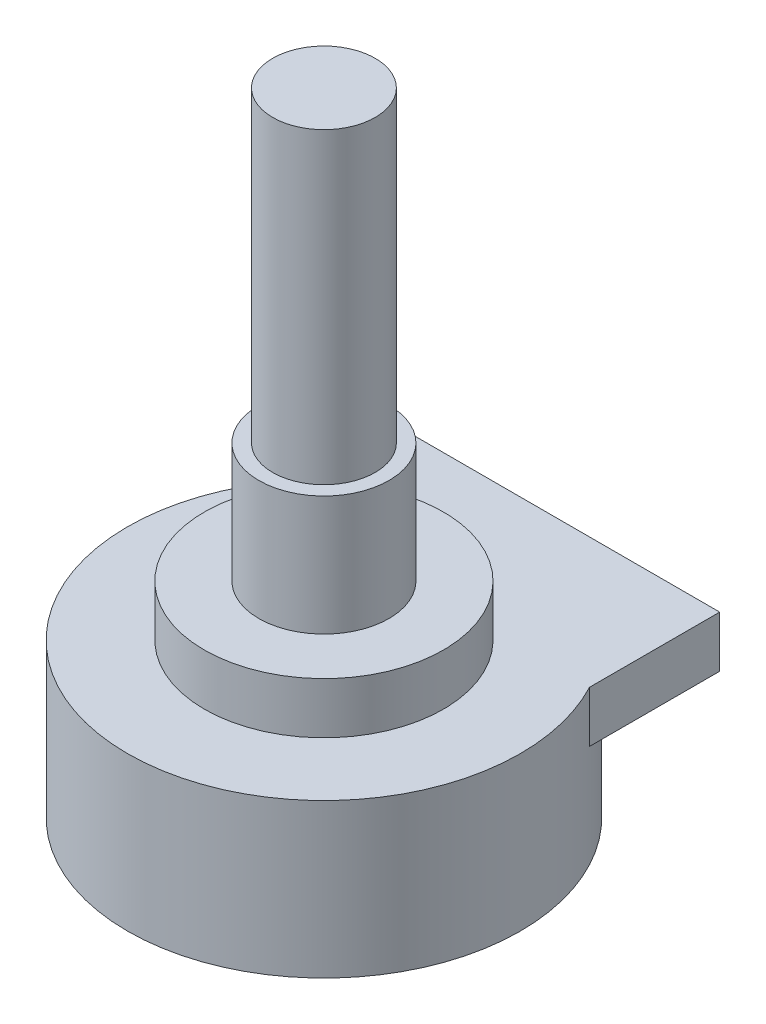
ISO-10303-21;
HEADER;
FILE_DESCRIPTION(('STEP AP214'),'2;1');
FILE_NAME('part.step','',(''),(''),'','','');
FILE_SCHEMA(('AUTOMOTIVE_DESIGN { 1 0 10303 214 1 1 1 1 }'));
ENDSEC;
DATA;
#1=APPLICATION_CONTEXT('core data for automotive mechanical design processes');
#2=APPLICATION_PROTOCOL_DEFINITION('international standard','automotive_design',2000,#1);
#3=PRODUCT_CONTEXT('',#1,'mechanical');
#4=PRODUCT('Part','Part','',(#3));
#5=PRODUCT_RELATED_PRODUCT_CATEGORY('part','',(#4));
#6=PRODUCT_DEFINITION_FORMATION('','',#4);
#7=PRODUCT_DEFINITION_CONTEXT('part definition',#1,'design');
#8=PRODUCT_DEFINITION('design','',#6,#7);
#9=PRODUCT_DEFINITION_SHAPE('','',#8);
#10=(LENGTH_UNIT() NAMED_UNIT(*) SI_UNIT(.MILLI.,.METRE.));
#11=(NAMED_UNIT(*) PLANE_ANGLE_UNIT() SI_UNIT($,.RADIAN.));
#12=(NAMED_UNIT(*) SI_UNIT($,.STERADIAN.) SOLID_ANGLE_UNIT());
#13=UNCERTAINTY_MEASURE_WITH_UNIT(LENGTH_MEASURE(1.E-05),#10,'distance_accuracy_value','');
#14=(GEOMETRIC_REPRESENTATION_CONTEXT(3) GLOBAL_UNCERTAINTY_ASSIGNED_CONTEXT((#13)) GLOBAL_UNIT_ASSIGNED_CONTEXT((#10,
#11,#12)) REPRESENTATION_CONTEXT('',''));
#15=CARTESIAN_POINT('',(0.,0.,0.));
#16=DIRECTION('',(0.,0.,1.));
#17=DIRECTION('',(1.,0.,0.));
#18=AXIS2_PLACEMENT_3D('',#15,#16,#17);
#19=CARTESIAN_POINT('',(11.2776,9.,0.));
#20=DIRECTION('',(1.,0.,0.));
#21=DIRECTION('',(0.,0.,-1.));
#22=AXIS2_PLACEMENT_3D('',#19,#20,#21);
#23=PLANE('',#22);
#24=DIRECTION('',(0.,-1.,0.));
#25=VECTOR('',#24,1.);
#26=CARTESIAN_POINT('',(11.2776,9.,-1.1684));
#27=LINE('',#26,#25);
#28=CARTESIAN_POINT('',(11.2776,9.,-1.1684));
#29=VERTEX_POINT('',#28);
#30=CARTESIAN_POINT('',(11.2776,6.,-1.1684));
#31=VERTEX_POINT('',#30);
#32=EDGE_CURVE('E91',#29,#31,#27,.T.);
#33=ORIENTED_EDGE('',*,*,#32,.T.);
#34=DIRECTION('',(0.,0.,1.));
#35=VECTOR('',#34,1.);
#36=CARTESIAN_POINT('',(11.2776,6.,-8.7884));
#37=LINE('',#36,#35);
#38=CARTESIAN_POINT('',(11.2776,6.,-8.7884));
#39=VERTEX_POINT('',#38);
#40=EDGE_CURVE('E79',#39,#31,#37,.T.);
#41=ORIENTED_EDGE('',*,*,#40,.F.);
#42=DIRECTION('',(0.,-1.,0.));
#43=VECTOR('',#42,1.);
#44=CARTESIAN_POINT('',(11.2776,9.,-8.7884));
#45=LINE('',#44,#43);
#46=CARTESIAN_POINT('',(11.2776,9.,-8.7884));
#47=VERTEX_POINT('',#46);
#48=EDGE_CURVE('E11',#47,#39,#45,.T.);
#49=ORIENTED_EDGE('',*,*,#48,.F.);
#50=DIRECTION('',(0.,0.,1.));
#51=VECTOR('',#50,1.);
#52=CARTESIAN_POINT('',(11.2776,9.,0.));
#53=LINE('',#52,#51);
#54=EDGE_CURVE('E106',#47,#29,#53,.T.);
#55=ORIENTED_EDGE('',*,*,#54,.T.);
#56=EDGE_LOOP('',(#33,#41,#49,#55));
#57=FACE_BOUND('',#56,.T.);
#58=ADVANCED_FACE('F35',(#57),#23,.T.);
#59=CARTESIAN_POINT('',(0.,9.,-8.7884));
#60=DIRECTION('',(0.,0.,-1.));
#61=DIRECTION('',(-1.,0.,0.));
#62=AXIS2_PLACEMENT_3D('',#59,#60,#61);
#63=PLANE('',#62);
#64=ORIENTED_EDGE('',*,*,#48,.T.);
#65=DIRECTION('',(1.,0.,0.));
#66=VECTOR('',#65,1.);
#67=CARTESIAN_POINT('',(-9.0424,6.,-8.7884));
#68=LINE('',#67,#66);
#69=CARTESIAN_POINT('',(-9.0424,6.,-8.7884));
#70=VERTEX_POINT('',#69);
#71=EDGE_CURVE('E88',#70,#39,#68,.T.);
#72=ORIENTED_EDGE('',*,*,#71,.F.);
#73=DIRECTION('',(0.,-1.,0.));
#74=VECTOR('',#73,1.);
#75=CARTESIAN_POINT('',(-9.0424,9.,-8.7884));
#76=LINE('',#75,#74);
#77=CARTESIAN_POINT('',(-9.0424,9.,-8.7884));
#78=VERTEX_POINT('',#77);
#79=EDGE_CURVE('E42',#78,#70,#76,.T.);
#80=ORIENTED_EDGE('',*,*,#79,.F.);
#81=DIRECTION('',(1.,0.,0.));
#82=VECTOR('',#81,1.);
#83=CARTESIAN_POINT('',(0.,9.,-8.7884));
#84=LINE('',#83,#82);
#85=EDGE_CURVE('E103',#78,#47,#84,.T.);
#86=ORIENTED_EDGE('',*,*,#85,.T.);
#87=EDGE_LOOP('',(#64,#72,#80,#86));
#88=FACE_BOUND('',#87,.T.);
#89=ADVANCED_FACE('F128',(#88),#63,.T.);
#90=CARTESIAN_POINT('',(-9.0424,9.,0.));
#91=DIRECTION('',(1.,0.,0.));
#92=DIRECTION('',(0.,0.,-1.));
#93=AXIS2_PLACEMENT_3D('',#90,#91,#92);
#94=PLANE('',#93);
#95=DIRECTION('',(0.,0.,-1.));
#96=VECTOR('',#95,1.);
#97=CARTESIAN_POINT('',(-9.0424,6.,-1.1684));
#98=LINE('',#97,#96);
#99=CARTESIAN_POINT('',(-9.0424,6.,-1.1684));
#100=VERTEX_POINT('',#99);
#101=EDGE_CURVE('E76',#100,#70,#98,.T.);
#102=ORIENTED_EDGE('',*,*,#101,.F.);
#103=DIRECTION('',(0.,-1.,0.));
#104=VECTOR('',#103,1.);
#105=CARTESIAN_POINT('',(-9.0424,9.,-1.1684));
#106=LINE('',#105,#104);
#107=CARTESIAN_POINT('',(-9.0424,9.,-1.1684));
#108=VERTEX_POINT('',#107);
#109=EDGE_CURVE('E87',#108,#100,#106,.T.);
#110=ORIENTED_EDGE('',*,*,#109,.F.);
#111=DIRECTION('',(0.,0.,1.));
#112=VECTOR('',#111,1.);
#113=CARTESIAN_POINT('',(-9.0424,9.,0.));
#114=LINE('',#113,#112);
#115=EDGE_CURVE('E101',#78,#108,#114,.T.);
#116=ORIENTED_EDGE('',*,*,#115,.F.);
#117=ORIENTED_EDGE('',*,*,#79,.T.);
#118=EDGE_LOOP('',(#102,#110,#116,#117));
#119=FACE_BOUND('',#118,.T.);
#120=ADVANCED_FACE('F85',(#119),#94,.F.);
#121=CARTESIAN_POINT('',(1.1176,9.,4.21902981392797));
#122=DIRECTION('',(0.,-1.,0.));
#123=DIRECTION('',(0.,0.,-1.));
#124=AXIS2_PLACEMENT_3D('',#121,#122,#123);
#125=CYLINDRICAL_SURFACE('',#124,11.5);
#126=CARTESIAN_POINT('',(1.1176,0.,4.21902981392797));
#127=DIRECTION('',(0.,1.,0.));
#128=DIRECTION('',(0.,0.,1.));
#129=AXIS2_PLACEMENT_3D('',#126,#127,#128);
#130=CIRCLE('',#129,11.5);
#131=CARTESIAN_POINT('',(1.1176,0.,15.719029813928));
#132=VERTEX_POINT('',#131);
#133=EDGE_CURVE('E95',#132,#132,#130,.T.);
#134=ORIENTED_EDGE('',*,*,#133,.T.);
#135=EDGE_LOOP('',(#134));
#136=FACE_BOUND('',#135,.T.);
#137=CARTESIAN_POINT('',(1.1176,6.,4.21902981392801));
#138=DIRECTION('',(0.,1.,0.));
#139=DIRECTION('',(0.,0.,-1.));
#140=AXIS2_PLACEMENT_3D('',#137,#138,#139);
#141=CIRCLE('',#140,11.5);
#142=EDGE_CURVE('E73',#31,#100,#141,.T.);
#143=ORIENTED_EDGE('',*,*,#142,.F.);
#144=ORIENTED_EDGE('',*,*,#32,.F.);
#145=CARTESIAN_POINT('',(1.1176,9.,4.21902981392797));
#146=DIRECTION('',(0.,1.,0.));
#147=DIRECTION('',(0.,0.,1.));
#148=AXIS2_PLACEMENT_3D('',#145,#146,#147);
#149=CIRCLE('',#148,11.5);
#150=EDGE_CURVE('E49',#108,#29,#149,.T.);
#151=ORIENTED_EDGE('',*,*,#150,.F.);
#152=ORIENTED_EDGE('',*,*,#109,.T.);
#153=EDGE_LOOP('',(#143,#144,#151,#152));
#154=FACE_BOUND('',#153,.T.);
#155=ADVANCED_FACE('F90',(#136,#154),#125,.T.);
#156=CARTESIAN_POINT('',(0.,9.,0.));
#157=DIRECTION('',(0.,1.,0.));
#158=DIRECTION('',(0.,0.,1.));
#159=AXIS2_PLACEMENT_3D('',#156,#157,#158);
#160=PLANE('',#159);
#161=CARTESIAN_POINT('',(1.1176,9.,4.21902981392797));
#162=DIRECTION('',(0.,1.,0.));
#163=DIRECTION('',(0.,0.,1.));
#164=AXIS2_PLACEMENT_3D('',#161,#162,#163);
#165=CIRCLE('',#164,7.);
#166=CARTESIAN_POINT('',(1.1176,9.,11.219029813928));
#167=VERTEX_POINT('',#166);
#168=EDGE_CURVE('E98',#167,#167,#165,.T.);
#169=ORIENTED_EDGE('',*,*,#168,.F.);
#170=EDGE_LOOP('',(#169));
#171=FACE_BOUND('',#170,.T.);
#172=ORIENTED_EDGE('',*,*,#54,.F.);
#173=ORIENTED_EDGE('',*,*,#85,.F.);
#174=ORIENTED_EDGE('',*,*,#115,.T.);
#175=ORIENTED_EDGE('',*,*,#150,.T.);
#176=EDGE_LOOP('',(#172,#173,#174,#175));
#177=FACE_BOUND('',#176,.T.);
#178=ADVANCED_FACE('F130',(#171,#177),#160,.T.);
#179=CARTESIAN_POINT('',(0.,0.,0.));
#180=DIRECTION('',(0.,1.,0.));
#181=DIRECTION('',(0.,0.,1.));
#182=AXIS2_PLACEMENT_3D('',#179,#180,#181);
#183=PLANE('',#182);
#184=ORIENTED_EDGE('',*,*,#133,.F.);
#185=EDGE_LOOP('',(#184));
#186=FACE_BOUND('',#185,.T.);
#187=ADVANCED_FACE('F132',(#186),#183,.F.);
#188=CARTESIAN_POINT('',(1.1176,12.,4.21902981392797));
#189=DIRECTION('',(0.,-1.,0.));
#190=DIRECTION('',(0.,0.,-1.));
#191=AXIS2_PLACEMENT_3D('',#188,#189,#190);
#192=CYLINDRICAL_SURFACE('',#191,7.);
#193=ORIENTED_EDGE('',*,*,#168,.T.);
#194=EDGE_LOOP('',(#193));
#195=FACE_BOUND('',#194,.T.);
#196=CARTESIAN_POINT('',(1.1176,12.,4.21902981392797));
#197=DIRECTION('',(0.,1.,0.));
#198=DIRECTION('',(0.,0.,1.));
#199=AXIS2_PLACEMENT_3D('',#196,#197,#198);
#200=CIRCLE('',#199,7.);
#201=CARTESIAN_POINT('',(1.1176,12.,11.219029813928));
#202=VERTEX_POINT('',#201);
#203=EDGE_CURVE('E99',#202,#202,#200,.T.);
#204=ORIENTED_EDGE('',*,*,#203,.F.);
#205=EDGE_LOOP('',(#204));
#206=FACE_BOUND('',#205,.T.);
#207=ADVANCED_FACE('F139',(#195,#206),#192,.T.);
#208=CARTESIAN_POINT('',(0.,12.,0.));
#209=DIRECTION('',(0.,1.,0.));
#210=DIRECTION('',(0.,0.,1.));
#211=AXIS2_PLACEMENT_3D('',#208,#209,#210);
#212=PLANE('',#211);
#213=CARTESIAN_POINT('',(1.1176,12.,4.21902981392797));
#214=DIRECTION('',(0.,1.,0.));
#215=DIRECTION('',(0.,0.,1.));
#216=AXIS2_PLACEMENT_3D('',#213,#214,#215);
#217=CIRCLE('',#216,3.81);
#218=CARTESIAN_POINT('',(1.1176,12.,8.02902981392797));
#219=VERTEX_POINT('',#218);
#220=EDGE_CURVE('E113',#219,#219,#217,.T.);
#221=ORIENTED_EDGE('',*,*,#220,.F.);
#222=EDGE_LOOP('',(#221));
#223=FACE_BOUND('',#222,.T.);
#224=ORIENTED_EDGE('',*,*,#203,.T.);
#225=EDGE_LOOP('',(#224));
#226=FACE_BOUND('',#225,.T.);
#227=ADVANCED_FACE('F212',(#223,#226),#212,.T.);
#228=CARTESIAN_POINT('',(1.1176,19.,4.21902981392797));
#229=DIRECTION('',(0.,-1.,0.));
#230=DIRECTION('',(0.,0.,-1.));
#231=AXIS2_PLACEMENT_3D('',#228,#229,#230);
#232=CYLINDRICAL_SURFACE('',#231,3.81);
#233=ORIENTED_EDGE('',*,*,#220,.T.);
#234=EDGE_LOOP('',(#233));
#235=FACE_BOUND('',#234,.T.);
#236=CARTESIAN_POINT('',(1.1176,19.,4.21902981392797));
#237=DIRECTION('',(0.,1.,0.));
#238=DIRECTION('',(0.,0.,1.));
#239=AXIS2_PLACEMENT_3D('',#236,#237,#238);
#240=CIRCLE('',#239,3.81);
#241=CARTESIAN_POINT('',(1.1176,19.,8.02902981392797));
#242=VERTEX_POINT('',#241);
#243=EDGE_CURVE('E116',#242,#242,#240,.T.);
#244=ORIENTED_EDGE('',*,*,#243,.F.);
#245=EDGE_LOOP('',(#244));
#246=FACE_BOUND('',#245,.T.);
#247=ADVANCED_FACE('F204',(#235,#246),#232,.T.);
#248=CARTESIAN_POINT('',(0.,19.,0.));
#249=DIRECTION('',(0.,1.,0.));
#250=DIRECTION('',(0.,0.,1.));
#251=AXIS2_PLACEMENT_3D('',#248,#249,#250);
#252=PLANE('',#251);
#253=CARTESIAN_POINT('',(1.1176,19.,4.21902981392797));
#254=DIRECTION('',(0.,1.,0.));
#255=DIRECTION('',(0.,0.,1.));
#256=AXIS2_PLACEMENT_3D('',#253,#254,#255);
#257=CIRCLE('',#256,3.);
#258=CARTESIAN_POINT('',(1.1176,19.,7.21902981392797));
#259=VERTEX_POINT('',#258);
#260=EDGE_CURVE('E119',#259,#259,#257,.T.);
#261=ORIENTED_EDGE('',*,*,#260,.F.);
#262=EDGE_LOOP('',(#261));
#263=FACE_BOUND('',#262,.T.);
#264=ORIENTED_EDGE('',*,*,#243,.T.);
#265=EDGE_LOOP('',(#264));
#266=FACE_BOUND('',#265,.T.);
#267=ADVANCED_FACE('F196',(#263,#266),#252,.T.);
#268=CARTESIAN_POINT('',(0.,37.,0.));
#269=DIRECTION('',(0.,1.,0.));
#270=DIRECTION('',(0.,0.,1.));
#271=AXIS2_PLACEMENT_3D('',#268,#269,#270);
#272=PLANE('',#271);
#273=CARTESIAN_POINT('',(1.1176,37.,4.21902981392797));
#274=DIRECTION('',(0.,1.,0.));
#275=DIRECTION('',(0.,0.,1.));
#276=AXIS2_PLACEMENT_3D('',#273,#274,#275);
#277=CIRCLE('',#276,3.);
#278=CARTESIAN_POINT('',(1.1176,37.,7.21902981392797));
#279=VERTEX_POINT('',#278);
#280=EDGE_CURVE('E122',#279,#279,#277,.T.);
#281=ORIENTED_EDGE('',*,*,#280,.T.);
#282=EDGE_LOOP('',(#281));
#283=FACE_BOUND('',#282,.T.);
#284=ADVANCED_FACE('F188',(#283),#272,.T.);
#285=CARTESIAN_POINT('',(1.1176,37.,4.21902981392797));
#286=DIRECTION('',(0.,-1.,0.));
#287=DIRECTION('',(0.,0.,-1.));
#288=AXIS2_PLACEMENT_3D('',#285,#286,#287);
#289=CYLINDRICAL_SURFACE('',#288,3.);
#290=ORIENTED_EDGE('',*,*,#260,.T.);
#291=EDGE_LOOP('',(#290));
#292=FACE_BOUND('',#291,.T.);
#293=ORIENTED_EDGE('',*,*,#280,.F.);
#294=EDGE_LOOP('',(#293));
#295=FACE_BOUND('',#294,.T.);
#296=ADVANCED_FACE('F179',(#292,#295),#289,.T.);
#297=CARTESIAN_POINT('',(1.1176,6.,4.21902981392801));
#298=DIRECTION('',(0.,-1.,0.));
#299=DIRECTION('',(0.,0.,-1.));
#300=AXIS2_PLACEMENT_3D('',#297,#298,#299);
#301=PLANE('',#300);
#302=ORIENTED_EDGE('',*,*,#142,.T.);
#303=ORIENTED_EDGE('',*,*,#101,.T.);
#304=ORIENTED_EDGE('',*,*,#71,.T.);
#305=ORIENTED_EDGE('',*,*,#40,.T.);
#306=EDGE_LOOP('',(#302,#303,#304,#305));
#307=FACE_BOUND('',#306,.T.);
#308=ADVANCED_FACE('F75',(#307),#301,.T.);
#309=CLOSED_SHELL('',(#58,#89,#120,#155,#178,#187,#207,#227,#247,#267,#284,#296,#308));
#310=MANIFOLD_SOLID_BREP('B2',#309);
#311=ADVANCED_BREP_SHAPE_REPRESENTATION('',(#18,#310),#14);
#312=SHAPE_DEFINITION_REPRESENTATION(#9,#311);
ENDSEC;
END-ISO-10303-21;
